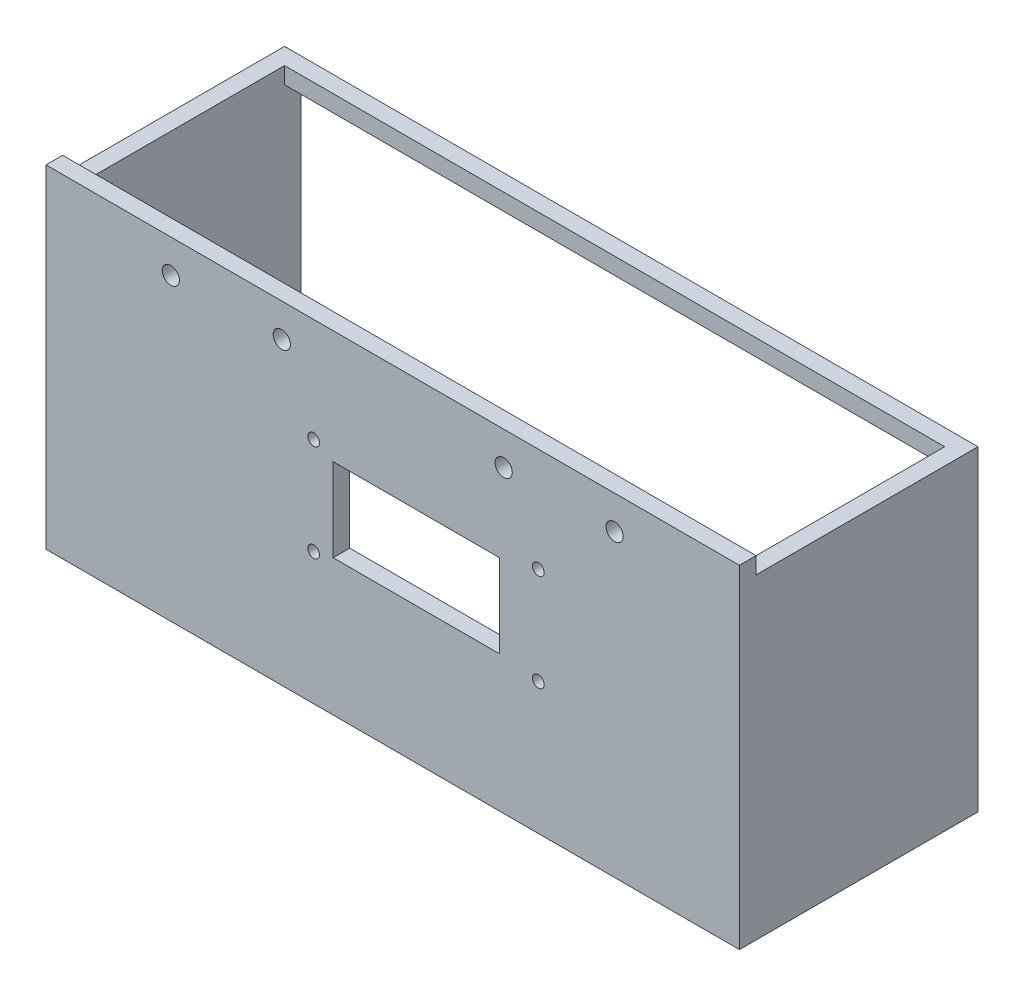
ISO-10303-21;
HEADER;
FILE_DESCRIPTION(('STEP AP214'),'2;1');
FILE_NAME('part.step','',(''),(''),'','','');
FILE_SCHEMA(('AUTOMOTIVE_DESIGN { 1 0 10303 214 1 1 1 1 }'));
ENDSEC;
DATA;
#1=APPLICATION_CONTEXT('core data for automotive mechanical design processes');
#2=APPLICATION_PROTOCOL_DEFINITION('international standard','automotive_design',2000,#1);
#3=PRODUCT_CONTEXT('',#1,'mechanical');
#4=PRODUCT('Part','Part','',(#3));
#5=PRODUCT_RELATED_PRODUCT_CATEGORY('part','',(#4));
#6=PRODUCT_DEFINITION_FORMATION('','',#4);
#7=PRODUCT_DEFINITION_CONTEXT('part definition',#1,'design');
#8=PRODUCT_DEFINITION('design','',#6,#7);
#9=PRODUCT_DEFINITION_SHAPE('','',#8);
#10=(LENGTH_UNIT() NAMED_UNIT(*) SI_UNIT(.MILLI.,.METRE.));
#11=(NAMED_UNIT(*) PLANE_ANGLE_UNIT() SI_UNIT($,.RADIAN.));
#12=(NAMED_UNIT(*) SI_UNIT($,.STERADIAN.) SOLID_ANGLE_UNIT());
#13=UNCERTAINTY_MEASURE_WITH_UNIT(LENGTH_MEASURE(1.E-05),#10,'distance_accuracy_value','');
#14=(GEOMETRIC_REPRESENTATION_CONTEXT(3) GLOBAL_UNCERTAINTY_ASSIGNED_CONTEXT((#13)) GLOBAL_UNIT_ASSIGNED_CONTEXT((#10,
#11,#12)) REPRESENTATION_CONTEXT('',''));
#15=CARTESIAN_POINT('',(0.,0.,0.));
#16=DIRECTION('',(0.,0.,1.));
#17=DIRECTION('',(1.,0.,0.));
#18=AXIS2_PLACEMENT_3D('',#15,#16,#17);
#19=CARTESIAN_POINT('',(0.,0.,3.));
#20=DIRECTION('',(0.,0.,1.));
#21=DIRECTION('',(1.,0.,0.));
#22=AXIS2_PLACEMENT_3D('',#19,#20,#21);
#23=PLANE('',#22);
#24=DIRECTION('',(1.,0.,0.));
#25=VECTOR('',#24,1.);
#26=CARTESIAN_POINT('',(-62.5,-30.,3.));
#27=LINE('',#26,#25);
#28=CARTESIAN_POINT('',(-62.5,-30.,3.));
#29=VERTEX_POINT('',#28);
#30=CARTESIAN_POINT('',(62.5,-30.,3.));
#31=VERTEX_POINT('',#30);
#32=EDGE_CURVE('E355',#29,#31,#27,.T.);
#33=ORIENTED_EDGE('',*,*,#32,.T.);
#34=DIRECTION('',(0.,1.,0.));
#35=VECTOR('',#34,1.);
#36=CARTESIAN_POINT('',(62.5,30.,3.));
#37=LINE('',#36,#35);
#38=CARTESIAN_POINT('',(62.5,30.,3.));
#39=VERTEX_POINT('',#38);
#40=EDGE_CURVE('E345',#31,#39,#37,.T.);
#41=ORIENTED_EDGE('',*,*,#40,.T.);
#42=DIRECTION('',(-1.,0.,0.));
#43=VECTOR('',#42,1.);
#44=CARTESIAN_POINT('',(-62.5,30.,3.));
#45=LINE('',#44,#43);
#46=CARTESIAN_POINT('',(-62.5,30.,3.));
#47=VERTEX_POINT('',#46);
#48=EDGE_CURVE('E348',#39,#47,#45,.T.);
#49=ORIENTED_EDGE('',*,*,#48,.T.);
#50=DIRECTION('',(0.,-1.,0.));
#51=VECTOR('',#50,1.);
#52=CARTESIAN_POINT('',(-62.5,30.,3.));
#53=LINE('',#52,#51);
#54=EDGE_CURVE('E352',#47,#29,#53,.T.);
#55=ORIENTED_EDGE('',*,*,#54,.T.);
#56=EDGE_LOOP('',(#33,#41,#49,#55));
#57=FACE_BOUND('',#56,.T.);
#58=CARTESIAN_POINT('',(26.25,11.25,3.));
#59=DIRECTION('',(0.,0.,1.));
#60=DIRECTION('',(1.,0.,0.));
#61=AXIS2_PLACEMENT_3D('',#58,#59,#60);
#62=CIRCLE('',#61,1.05);
#63=CARTESIAN_POINT('',(27.3,11.25,3.));
#64=VERTEX_POINT('',#63);
#65=EDGE_CURVE('E289',#64,#64,#62,.T.);
#66=ORIENTED_EDGE('',*,*,#65,.F.);
#67=EDGE_LOOP('',(#66));
#68=FACE_BOUND('',#67,.T.);
#69=CARTESIAN_POINT('',(-14.25,11.25,3.));
#70=DIRECTION('',(0.,0.,1.));
#71=DIRECTION('',(1.,0.,0.));
#72=AXIS2_PLACEMENT_3D('',#69,#70,#71);
#73=CIRCLE('',#72,1.05);
#74=CARTESIAN_POINT('',(-13.2,11.25,3.));
#75=VERTEX_POINT('',#74);
#76=EDGE_CURVE('E305',#75,#75,#73,.T.);
#77=ORIENTED_EDGE('',*,*,#76,.F.);
#78=EDGE_LOOP('',(#77));
#79=FACE_BOUND('',#78,.T.);
#80=CARTESIAN_POINT('',(20.,24.,3.));
#81=DIRECTION('',(0.,0.,1.));
#82=DIRECTION('',(1.,0.,0.));
#83=AXIS2_PLACEMENT_3D('',#80,#81,#82);
#84=CIRCLE('',#83,1.55);
#85=CARTESIAN_POINT('',(21.55,24.,3.));
#86=VERTEX_POINT('',#85);
#87=EDGE_CURVE('E321',#86,#86,#84,.T.);
#88=ORIENTED_EDGE('',*,*,#87,.F.);
#89=EDGE_LOOP('',(#88));
#90=FACE_BOUND('',#89,.T.);
#91=CARTESIAN_POINT('',(-40.,24.,3.));
#92=DIRECTION('',(0.,0.,1.));
#93=DIRECTION('',(1.,0.,0.));
#94=AXIS2_PLACEMENT_3D('',#91,#92,#93);
#95=CIRCLE('',#94,1.55);
#96=CARTESIAN_POINT('',(-38.45,24.,3.));
#97=VERTEX_POINT('',#96);
#98=EDGE_CURVE('E337',#97,#97,#95,.T.);
#99=ORIENTED_EDGE('',*,*,#98,.F.);
#100=EDGE_LOOP('',(#99));
#101=FACE_BOUND('',#100,.T.);
#102=CARTESIAN_POINT('',(-20.,24.,3.));
#103=DIRECTION('',(0.,0.,1.));
#104=DIRECTION('',(1.,0.,0.));
#105=AXIS2_PLACEMENT_3D('',#102,#103,#104);
#106=CIRCLE('',#105,1.55);
#107=CARTESIAN_POINT('',(-18.45,24.,3.));
#108=VERTEX_POINT('',#107);
#109=EDGE_CURVE('E329',#108,#108,#106,.T.);
#110=ORIENTED_EDGE('',*,*,#109,.F.);
#111=EDGE_LOOP('',(#110));
#112=FACE_BOUND('',#111,.T.);
#113=CARTESIAN_POINT('',(40.,24.,3.));
#114=DIRECTION('',(0.,0.,1.));
#115=DIRECTION('',(1.,0.,0.));
#116=AXIS2_PLACEMENT_3D('',#113,#114,#115);
#117=CIRCLE('',#116,1.54999999999999);
#118=CARTESIAN_POINT('',(41.55,24.,3.));
#119=VERTEX_POINT('',#118);
#120=EDGE_CURVE('E313',#119,#119,#117,.T.);
#121=ORIENTED_EDGE('',*,*,#120,.F.);
#122=EDGE_LOOP('',(#121));
#123=FACE_BOUND('',#122,.T.);
#124=CARTESIAN_POINT('',(-14.25,-6.25,3.));
#125=DIRECTION('',(0.,0.,1.));
#126=DIRECTION('',(1.,0.,0.));
#127=AXIS2_PLACEMENT_3D('',#124,#125,#126);
#128=CIRCLE('',#127,1.05);
#129=CARTESIAN_POINT('',(-13.2,-6.25,3.));
#130=VERTEX_POINT('',#129);
#131=EDGE_CURVE('E297',#130,#130,#128,.T.);
#132=ORIENTED_EDGE('',*,*,#131,.F.);
#133=EDGE_LOOP('',(#132));
#134=FACE_BOUND('',#133,.T.);
#135=CARTESIAN_POINT('',(26.25,-6.25,3.));
#136=DIRECTION('',(0.,0.,1.));
#137=DIRECTION('',(1.,0.,0.));
#138=AXIS2_PLACEMENT_3D('',#135,#136,#137);
#139=CIRCLE('',#138,1.05);
#140=CARTESIAN_POINT('',(27.3,-6.25,3.));
#141=VERTEX_POINT('',#140);
#142=EDGE_CURVE('E281',#141,#141,#139,.T.);
#143=ORIENTED_EDGE('',*,*,#142,.F.);
#144=EDGE_LOOP('',(#143));
#145=FACE_BOUND('',#144,.T.);
#146=DIRECTION('',(-1.,0.,0.));
#147=VECTOR('',#146,1.);
#148=CARTESIAN_POINT('',(-10.75,9.55,3.));
#149=LINE('',#148,#147);
#150=CARTESIAN_POINT('',(19.25,9.55,3.));
#151=VERTEX_POINT('',#150);
#152=CARTESIAN_POINT('',(-10.75,9.55,3.));
#153=VERTEX_POINT('',#152);
#154=EDGE_CURVE('E241',#151,#153,#149,.T.);
#155=ORIENTED_EDGE('',*,*,#154,.F.);
#156=DIRECTION('',(0.,1.,0.));
#157=VECTOR('',#156,1.);
#158=CARTESIAN_POINT('',(19.25,9.55,3.));
#159=LINE('',#158,#157);
#160=CARTESIAN_POINT('',(19.25,-5.45,3.));
#161=VERTEX_POINT('',#160);
#162=EDGE_CURVE('E238',#161,#151,#159,.T.);
#163=ORIENTED_EDGE('',*,*,#162,.F.);
#164=DIRECTION('',(1.,0.,0.));
#165=VECTOR('',#164,1.);
#166=CARTESIAN_POINT('',(-10.75,-5.45,3.));
#167=LINE('',#166,#165);
#168=CARTESIAN_POINT('',(-10.75,-5.45,3.));
#169=VERTEX_POINT('',#168);
#170=EDGE_CURVE('E249',#169,#161,#167,.T.);
#171=ORIENTED_EDGE('',*,*,#170,.F.);
#172=DIRECTION('',(0.,-1.,0.));
#173=VECTOR('',#172,1.);
#174=CARTESIAN_POINT('',(-10.75,9.55,3.));
#175=LINE('',#174,#173);
#176=EDGE_CURVE('E245',#153,#169,#175,.T.);
#177=ORIENTED_EDGE('',*,*,#176,.F.);
#178=EDGE_LOOP('',(#155,#163,#171,#177));
#179=FACE_BOUND('',#178,.T.);
#180=ADVANCED_FACE('F39',(#57,#68,#79,#90,#101,#112,#123,#134,#145,#179),#23,.T.);
#181=CARTESIAN_POINT('',(0.,0.,0.));
#182=DIRECTION('',(0.,0.,1.));
#183=DIRECTION('',(1.,0.,0.));
#184=AXIS2_PLACEMENT_3D('',#181,#182,#183);
#185=PLANE('',#184);
#186=CARTESIAN_POINT('',(26.25,-6.25,0.));
#187=DIRECTION('',(0.,0.,1.));
#188=DIRECTION('',(1.,0.,0.));
#189=AXIS2_PLACEMENT_3D('',#186,#187,#188);
#190=CIRCLE('',#189,1.05);
#191=CARTESIAN_POINT('',(27.3,-6.25,0.));
#192=VERTEX_POINT('',#191);
#193=EDGE_CURVE('E280',#192,#192,#190,.T.);
#194=ORIENTED_EDGE('',*,*,#193,.T.);
#195=EDGE_LOOP('',(#194));
#196=FACE_BOUND('',#195,.T.);
#197=CARTESIAN_POINT('',(26.25,11.25,0.));
#198=DIRECTION('',(0.,0.,1.));
#199=DIRECTION('',(1.,0.,0.));
#200=AXIS2_PLACEMENT_3D('',#197,#198,#199);
#201=CIRCLE('',#200,1.05);
#202=CARTESIAN_POINT('',(27.3,11.25,0.));
#203=VERTEX_POINT('',#202);
#204=EDGE_CURVE('E285',#203,#203,#201,.T.);
#205=ORIENTED_EDGE('',*,*,#204,.T.);
#206=EDGE_LOOP('',(#205));
#207=FACE_BOUND('',#206,.T.);
#208=CARTESIAN_POINT('',(-14.25,-6.25,0.));
#209=DIRECTION('',(0.,0.,1.));
#210=DIRECTION('',(1.,0.,0.));
#211=AXIS2_PLACEMENT_3D('',#208,#209,#210);
#212=CIRCLE('',#211,1.05);
#213=CARTESIAN_POINT('',(-13.2,-6.25,0.));
#214=VERTEX_POINT('',#213);
#215=EDGE_CURVE('E293',#214,#214,#212,.T.);
#216=ORIENTED_EDGE('',*,*,#215,.T.);
#217=EDGE_LOOP('',(#216));
#218=FACE_BOUND('',#217,.T.);
#219=CARTESIAN_POINT('',(-14.25,11.25,0.));
#220=DIRECTION('',(0.,0.,1.));
#221=DIRECTION('',(1.,0.,0.));
#222=AXIS2_PLACEMENT_3D('',#219,#220,#221);
#223=CIRCLE('',#222,1.05);
#224=CARTESIAN_POINT('',(-13.2,11.25,0.));
#225=VERTEX_POINT('',#224);
#226=EDGE_CURVE('E301',#225,#225,#223,.T.);
#227=ORIENTED_EDGE('',*,*,#226,.T.);
#228=EDGE_LOOP('',(#227));
#229=FACE_BOUND('',#228,.T.);
#230=CARTESIAN_POINT('',(40.,24.,0.));
#231=DIRECTION('',(0.,0.,1.));
#232=DIRECTION('',(1.,0.,0.));
#233=AXIS2_PLACEMENT_3D('',#230,#231,#232);
#234=CIRCLE('',#233,1.54999999999999);
#235=CARTESIAN_POINT('',(41.55,24.,0.));
#236=VERTEX_POINT('',#235);
#237=EDGE_CURVE('E309',#236,#236,#234,.T.);
#238=ORIENTED_EDGE('',*,*,#237,.T.);
#239=EDGE_LOOP('',(#238));
#240=FACE_BOUND('',#239,.T.);
#241=CARTESIAN_POINT('',(20.,24.,0.));
#242=DIRECTION('',(0.,0.,1.));
#243=DIRECTION('',(1.,0.,0.));
#244=AXIS2_PLACEMENT_3D('',#241,#242,#243);
#245=CIRCLE('',#244,1.55);
#246=CARTESIAN_POINT('',(21.55,24.,0.));
#247=VERTEX_POINT('',#246);
#248=EDGE_CURVE('E317',#247,#247,#245,.T.);
#249=ORIENTED_EDGE('',*,*,#248,.T.);
#250=EDGE_LOOP('',(#249));
#251=FACE_BOUND('',#250,.T.);
#252=CARTESIAN_POINT('',(-20.,24.,0.));
#253=DIRECTION('',(0.,0.,1.));
#254=DIRECTION('',(1.,0.,0.));
#255=AXIS2_PLACEMENT_3D('',#252,#253,#254);
#256=CIRCLE('',#255,1.55);
#257=CARTESIAN_POINT('',(-18.45,24.,0.));
#258=VERTEX_POINT('',#257);
#259=EDGE_CURVE('E325',#258,#258,#256,.T.);
#260=ORIENTED_EDGE('',*,*,#259,.T.);
#261=EDGE_LOOP('',(#260));
#262=FACE_BOUND('',#261,.T.);
#263=CARTESIAN_POINT('',(-40.,24.,0.));
#264=DIRECTION('',(0.,0.,1.));
#265=DIRECTION('',(1.,0.,0.));
#266=AXIS2_PLACEMENT_3D('',#263,#264,#265);
#267=CIRCLE('',#266,1.55);
#268=CARTESIAN_POINT('',(-38.45,24.,0.));
#269=VERTEX_POINT('',#268);
#270=EDGE_CURVE('E333',#269,#269,#267,.T.);
#271=ORIENTED_EDGE('',*,*,#270,.T.);
#272=EDGE_LOOP('',(#271));
#273=FACE_BOUND('',#272,.T.);
#274=DIRECTION('',(-1.,0.,0.));
#275=VECTOR('',#274,1.);
#276=CARTESIAN_POINT('',(0.,27.,0.));
#277=LINE('',#276,#275);
#278=CARTESIAN_POINT('',(62.5,27.,0.));
#279=VERTEX_POINT('',#278);
#280=CARTESIAN_POINT('',(59.5,27.,0.));
#281=VERTEX_POINT('',#280);
#282=EDGE_CURVE('E211',#279,#281,#277,.T.);
#283=ORIENTED_EDGE('',*,*,#282,.T.);
#284=DIRECTION('',(0.,-1.,0.));
#285=VECTOR('',#284,1.);
#286=CARTESIAN_POINT('',(59.5,0.,0.));
#287=LINE('',#286,#285);
#288=CARTESIAN_POINT('',(59.5,-30.,0.));
#289=VERTEX_POINT('',#288);
#290=EDGE_CURVE('E202',#281,#289,#287,.T.);
#291=ORIENTED_EDGE('',*,*,#290,.T.);
#292=DIRECTION('',(1.,0.,0.));
#293=VECTOR('',#292,1.);
#294=CARTESIAN_POINT('',(-62.5,-30.,0.));
#295=LINE('',#294,#293);
#296=CARTESIAN_POINT('',(-59.5,-30.,0.));
#297=VERTEX_POINT('',#296);
#298=EDGE_CURVE('E349',#297,#289,#295,.T.);
#299=ORIENTED_EDGE('',*,*,#298,.F.);
#300=DIRECTION('',(0.,1.,0.));
#301=VECTOR('',#300,1.);
#302=CARTESIAN_POINT('',(-59.5,0.,0.));
#303=LINE('',#302,#301);
#304=CARTESIAN_POINT('',(-59.5,27.,0.));
#305=VERTEX_POINT('',#304);
#306=EDGE_CURVE('E229',#297,#305,#303,.T.);
#307=ORIENTED_EDGE('',*,*,#306,.T.);
#308=DIRECTION('',(-1.,0.,0.));
#309=VECTOR('',#308,1.);
#310=CARTESIAN_POINT('',(0.,27.,0.));
#311=LINE('',#310,#309);
#312=CARTESIAN_POINT('',(-62.5,27.,0.));
#313=VERTEX_POINT('',#312);
#314=EDGE_CURVE('E156',#305,#313,#311,.T.);
#315=ORIENTED_EDGE('',*,*,#314,.T.);
#316=DIRECTION('',(0.,-1.,0.));
#317=VECTOR('',#316,1.);
#318=CARTESIAN_POINT('',(-62.5,30.,0.));
#319=LINE('',#318,#317);
#320=CARTESIAN_POINT('',(-62.5,30.,0.));
#321=VERTEX_POINT('',#320);
#322=EDGE_CURVE('E364',#321,#313,#319,.T.);
#323=ORIENTED_EDGE('',*,*,#322,.F.);
#324=DIRECTION('',(-1.,0.,0.));
#325=VECTOR('',#324,1.);
#326=CARTESIAN_POINT('',(-62.5,30.,0.));
#327=LINE('',#326,#325);
#328=CARTESIAN_POINT('',(62.5,30.,0.));
#329=VERTEX_POINT('',#328);
#330=EDGE_CURVE('E361',#329,#321,#327,.T.);
#331=ORIENTED_EDGE('',*,*,#330,.F.);
#332=DIRECTION('',(0.,1.,0.));
#333=VECTOR('',#332,1.);
#334=CARTESIAN_POINT('',(62.5,30.,0.));
#335=LINE('',#334,#333);
#336=EDGE_CURVE('E341',#279,#329,#335,.T.);
#337=ORIENTED_EDGE('',*,*,#336,.F.);
#338=EDGE_LOOP('',(#283,#291,#299,#307,#315,#323,#331,#337));
#339=FACE_BOUND('',#338,.T.);
#340=DIRECTION('',(0.,1.,0.));
#341=VECTOR('',#340,1.);
#342=CARTESIAN_POINT('',(19.25,9.55,0.));
#343=LINE('',#342,#341);
#344=CARTESIAN_POINT('',(19.25,-5.45,0.));
#345=VERTEX_POINT('',#344);
#346=CARTESIAN_POINT('',(19.25,9.55,0.));
#347=VERTEX_POINT('',#346);
#348=EDGE_CURVE('E237',#345,#347,#343,.T.);
#349=ORIENTED_EDGE('',*,*,#348,.T.);
#350=DIRECTION('',(-1.,0.,0.));
#351=VECTOR('',#350,1.);
#352=CARTESIAN_POINT('',(-10.75,9.55,0.));
#353=LINE('',#352,#351);
#354=CARTESIAN_POINT('',(-10.75,9.55,0.));
#355=VERTEX_POINT('',#354);
#356=EDGE_CURVE('E256',#347,#355,#353,.T.);
#357=ORIENTED_EDGE('',*,*,#356,.T.);
#358=DIRECTION('',(0.,-1.,0.));
#359=VECTOR('',#358,1.);
#360=CARTESIAN_POINT('',(-10.75,9.55,0.));
#361=LINE('',#360,#359);
#362=CARTESIAN_POINT('',(-10.75,-5.45,0.));
#363=VERTEX_POINT('',#362);
#364=EDGE_CURVE('E260',#355,#363,#361,.T.);
#365=ORIENTED_EDGE('',*,*,#364,.T.);
#366=DIRECTION('',(1.,0.,0.));
#367=VECTOR('',#366,1.);
#368=CARTESIAN_POINT('',(-10.75,-5.45,0.));
#369=LINE('',#368,#367);
#370=EDGE_CURVE('E242',#363,#345,#369,.T.);
#371=ORIENTED_EDGE('',*,*,#370,.T.);
#372=EDGE_LOOP('',(#349,#357,#365,#371));
#373=FACE_BOUND('',#372,.T.);
#374=ADVANCED_FACE('F395',(#196,#207,#218,#229,#240,#251,#262,#273,#339,#373),#185,.F.);
#375=CARTESIAN_POINT('',(62.5,30.,3.));
#376=DIRECTION('',(-1.,0.,0.));
#377=DIRECTION('',(0.,-1.,0.));
#378=AXIS2_PLACEMENT_3D('',#375,#376,#377);
#379=PLANE('',#378);
#380=DIRECTION('',(0.,0.,1.));
#381=VECTOR('',#380,1.);
#382=CARTESIAN_POINT('',(62.5,27.,-40.));
#383=LINE('',#382,#381);
#384=CARTESIAN_POINT('',(62.5,27.,-40.));
#385=VERTEX_POINT('',#384);
#386=EDGE_CURVE('E198',#385,#279,#383,.T.);
#387=ORIENTED_EDGE('',*,*,#386,.T.);
#388=ORIENTED_EDGE('',*,*,#336,.T.);
#389=DIRECTION('',(0.,0.,-1.));
#390=VECTOR('',#389,1.);
#391=CARTESIAN_POINT('',(62.5,30.,3.));
#392=LINE('',#391,#390);
#393=EDGE_CURVE('E48',#39,#329,#392,.T.);
#394=ORIENTED_EDGE('',*,*,#393,.F.);
#395=ORIENTED_EDGE('',*,*,#40,.F.);
#396=DIRECTION('',(0.,0.,-1.));
#397=VECTOR('',#396,1.);
#398=CARTESIAN_POINT('',(62.5,-30.,3.));
#399=LINE('',#398,#397);
#400=CARTESIAN_POINT('',(62.5,-30.,-40.));
#401=VERTEX_POINT('',#400);
#402=EDGE_CURVE('E358',#31,#401,#399,.T.);
#403=ORIENTED_EDGE('',*,*,#402,.T.);
#404=DIRECTION('',(0.,1.,0.));
#405=VECTOR('',#404,1.);
#406=CARTESIAN_POINT('',(62.5,-30.,-40.));
#407=LINE('',#406,#405);
#408=EDGE_CURVE('E169',#401,#385,#407,.T.);
#409=ORIENTED_EDGE('',*,*,#408,.T.);
#410=EDGE_LOOP('',(#387,#388,#394,#395,#403,#409));
#411=FACE_BOUND('',#410,.T.);
#412=ADVANCED_FACE('F41',(#411),#379,.F.);
#413=CARTESIAN_POINT('',(-62.5,30.,3.));
#414=DIRECTION('',(0.,-1.,0.));
#415=DIRECTION('',(0.,0.,-1.));
#416=AXIS2_PLACEMENT_3D('',#413,#414,#415);
#417=PLANE('',#416);
#418=ORIENTED_EDGE('',*,*,#330,.T.);
#419=DIRECTION('',(0.,0.,-1.));
#420=VECTOR('',#419,1.);
#421=CARTESIAN_POINT('',(-62.5,30.,3.));
#422=LINE('',#421,#420);
#423=EDGE_CURVE('E377',#47,#321,#422,.T.);
#424=ORIENTED_EDGE('',*,*,#423,.F.);
#425=ORIENTED_EDGE('',*,*,#48,.F.);
#426=ORIENTED_EDGE('',*,*,#393,.T.);
#427=EDGE_LOOP('',(#418,#424,#425,#426));
#428=FACE_BOUND('',#427,.T.);
#429=ADVANCED_FACE('F385',(#428),#417,.F.);
#430=CARTESIAN_POINT('',(-62.5,30.,3.));
#431=DIRECTION('',(1.,0.,0.));
#432=DIRECTION('',(0.,0.,-1.));
#433=AXIS2_PLACEMENT_3D('',#430,#431,#432);
#434=PLANE('',#433);
#435=ORIENTED_EDGE('',*,*,#322,.T.);
#436=DIRECTION('',(0.,0.,1.));
#437=VECTOR('',#436,1.);
#438=CARTESIAN_POINT('',(-62.5,27.,-40.));
#439=LINE('',#438,#437);
#440=CARTESIAN_POINT('',(-62.5,27.,-40.));
#441=VERTEX_POINT('',#440);
#442=EDGE_CURVE('E160',#441,#313,#439,.T.);
#443=ORIENTED_EDGE('',*,*,#442,.F.);
#444=DIRECTION('',(0.,-1.,0.));
#445=VECTOR('',#444,1.);
#446=CARTESIAN_POINT('',(-62.5,-30.,-40.));
#447=LINE('',#446,#445);
#448=CARTESIAN_POINT('',(-62.5,-30.,-40.));
#449=VERTEX_POINT('',#448);
#450=EDGE_CURVE('E215',#441,#449,#447,.T.);
#451=ORIENTED_EDGE('',*,*,#450,.T.);
#452=DIRECTION('',(0.,0.,-1.));
#453=VECTOR('',#452,1.);
#454=CARTESIAN_POINT('',(-62.5,-30.,3.));
#455=LINE('',#454,#453);
#456=EDGE_CURVE('E373',#29,#449,#455,.T.);
#457=ORIENTED_EDGE('',*,*,#456,.F.);
#458=ORIENTED_EDGE('',*,*,#54,.F.);
#459=ORIENTED_EDGE('',*,*,#423,.T.);
#460=EDGE_LOOP('',(#435,#443,#451,#457,#458,#459));
#461=FACE_BOUND('',#460,.T.);
#462=ADVANCED_FACE('F398',(#461),#434,.F.);
#463=CARTESIAN_POINT('',(-62.5,-30.,3.));
#464=DIRECTION('',(0.,1.,0.));
#465=DIRECTION('',(0.,0.,1.));
#466=AXIS2_PLACEMENT_3D('',#463,#464,#465);
#467=PLANE('',#466);
#468=ORIENTED_EDGE('',*,*,#298,.T.);
#469=DIRECTION('',(0.,0.,1.));
#470=VECTOR('',#469,1.);
#471=CARTESIAN_POINT('',(59.5,-30.,-40.));
#472=LINE('',#471,#470);
#473=CARTESIAN_POINT('',(59.5,-30.,-40.));
#474=VERTEX_POINT('',#473);
#475=EDGE_CURVE('E199',#474,#289,#472,.T.);
#476=ORIENTED_EDGE('',*,*,#475,.F.);
#477=DIRECTION('',(1.,0.,0.));
#478=VECTOR('',#477,1.);
#479=CARTESIAN_POINT('',(62.5,-30.,-40.));
#480=LINE('',#479,#478);
#481=EDGE_CURVE('E194',#474,#401,#480,.T.);
#482=ORIENTED_EDGE('',*,*,#481,.T.);
#483=ORIENTED_EDGE('',*,*,#402,.F.);
#484=ORIENTED_EDGE('',*,*,#32,.F.);
#485=ORIENTED_EDGE('',*,*,#456,.T.);
#486=DIRECTION('',(1.,0.,0.));
#487=VECTOR('',#486,1.);
#488=CARTESIAN_POINT('',(-62.5,-30.,-40.));
#489=LINE('',#488,#487);
#490=CARTESIAN_POINT('',(-59.5,-30.,-40.));
#491=VERTEX_POINT('',#490);
#492=EDGE_CURVE('E218',#449,#491,#489,.T.);
#493=ORIENTED_EDGE('',*,*,#492,.T.);
#494=DIRECTION('',(0.,0.,1.));
#495=VECTOR('',#494,1.);
#496=CARTESIAN_POINT('',(-59.5,-30.,-40.));
#497=LINE('',#496,#495);
#498=EDGE_CURVE('E161',#491,#297,#497,.T.);
#499=ORIENTED_EDGE('',*,*,#498,.T.);
#500=EDGE_LOOP('',(#468,#476,#482,#483,#484,#485,#493,#499));
#501=FACE_BOUND('',#500,.T.);
#502=ADVANCED_FACE('F407',(#501),#467,.F.);
#503=CARTESIAN_POINT('',(-40.,24.,3.));
#504=DIRECTION('',(0.,0.,-1.));
#505=DIRECTION('',(-1.,0.,0.));
#506=AXIS2_PLACEMENT_3D('',#503,#504,#505);
#507=CYLINDRICAL_SURFACE('',#506,1.55);
#508=ORIENTED_EDGE('',*,*,#98,.T.);
#509=EDGE_LOOP('',(#508));
#510=FACE_BOUND('',#509,.T.);
#511=ORIENTED_EDGE('',*,*,#270,.F.);
#512=EDGE_LOOP('',(#511));
#513=FACE_BOUND('',#512,.T.);
#514=ADVANCED_FACE('F439',(#510,#513),#507,.F.);
#515=CARTESIAN_POINT('',(-20.,24.,3.));
#516=DIRECTION('',(0.,0.,-1.));
#517=DIRECTION('',(-1.,0.,0.));
#518=AXIS2_PLACEMENT_3D('',#515,#516,#517);
#519=CYLINDRICAL_SURFACE('',#518,1.55);
#520=ORIENTED_EDGE('',*,*,#109,.T.);
#521=EDGE_LOOP('',(#520));
#522=FACE_BOUND('',#521,.T.);
#523=ORIENTED_EDGE('',*,*,#259,.F.);
#524=EDGE_LOOP('',(#523));
#525=FACE_BOUND('',#524,.T.);
#526=ADVANCED_FACE('F477',(#522,#525),#519,.F.);
#527=CARTESIAN_POINT('',(20.,24.,3.));
#528=DIRECTION('',(0.,0.,-1.));
#529=DIRECTION('',(-1.,0.,0.));
#530=AXIS2_PLACEMENT_3D('',#527,#528,#529);
#531=CYLINDRICAL_SURFACE('',#530,1.55);
#532=ORIENTED_EDGE('',*,*,#87,.T.);
#533=EDGE_LOOP('',(#532));
#534=FACE_BOUND('',#533,.T.);
#535=ORIENTED_EDGE('',*,*,#248,.F.);
#536=EDGE_LOOP('',(#535));
#537=FACE_BOUND('',#536,.T.);
#538=ADVANCED_FACE('F484',(#534,#537),#531,.F.);
#539=CARTESIAN_POINT('',(40.,24.,3.));
#540=DIRECTION('',(0.,0.,-1.));
#541=DIRECTION('',(-1.,0.,0.));
#542=AXIS2_PLACEMENT_3D('',#539,#540,#541);
#543=CYLINDRICAL_SURFACE('',#542,1.54999999999999);
#544=ORIENTED_EDGE('',*,*,#120,.T.);
#545=EDGE_LOOP('',(#544));
#546=FACE_BOUND('',#545,.T.);
#547=ORIENTED_EDGE('',*,*,#237,.F.);
#548=EDGE_LOOP('',(#547));
#549=FACE_BOUND('',#548,.T.);
#550=ADVANCED_FACE('F491',(#546,#549),#543,.F.);
#551=CARTESIAN_POINT('',(-14.25,11.25,3.));
#552=DIRECTION('',(0.,0.,-1.));
#553=DIRECTION('',(-1.,0.,0.));
#554=AXIS2_PLACEMENT_3D('',#551,#552,#553);
#555=CYLINDRICAL_SURFACE('',#554,1.05);
#556=ORIENTED_EDGE('',*,*,#76,.T.);
#557=EDGE_LOOP('',(#556));
#558=FACE_BOUND('',#557,.T.);
#559=ORIENTED_EDGE('',*,*,#226,.F.);
#560=EDGE_LOOP('',(#559));
#561=FACE_BOUND('',#560,.T.);
#562=ADVANCED_FACE('F499',(#558,#561),#555,.F.);
#563=CARTESIAN_POINT('',(-14.25,-6.25,3.));
#564=DIRECTION('',(0.,0.,-1.));
#565=DIRECTION('',(-1.,0.,0.));
#566=AXIS2_PLACEMENT_3D('',#563,#564,#565);
#567=CYLINDRICAL_SURFACE('',#566,1.05);
#568=ORIENTED_EDGE('',*,*,#131,.T.);
#569=EDGE_LOOP('',(#568));
#570=FACE_BOUND('',#569,.T.);
#571=ORIENTED_EDGE('',*,*,#215,.F.);
#572=EDGE_LOOP('',(#571));
#573=FACE_BOUND('',#572,.T.);
#574=ADVANCED_FACE('F507',(#570,#573),#567,.F.);
#575=CARTESIAN_POINT('',(26.25,11.25,3.));
#576=DIRECTION('',(0.,0.,-1.));
#577=DIRECTION('',(-1.,0.,0.));
#578=AXIS2_PLACEMENT_3D('',#575,#576,#577);
#579=CYLINDRICAL_SURFACE('',#578,1.05);
#580=ORIENTED_EDGE('',*,*,#65,.T.);
#581=EDGE_LOOP('',(#580));
#582=FACE_BOUND('',#581,.T.);
#583=ORIENTED_EDGE('',*,*,#204,.F.);
#584=EDGE_LOOP('',(#583));
#585=FACE_BOUND('',#584,.T.);
#586=ADVANCED_FACE('F515',(#582,#585),#579,.F.);
#587=CARTESIAN_POINT('',(26.25,-6.25,3.));
#588=DIRECTION('',(0.,0.,-1.));
#589=DIRECTION('',(-1.,0.,0.));
#590=AXIS2_PLACEMENT_3D('',#587,#588,#589);
#591=CYLINDRICAL_SURFACE('',#590,1.05);
#592=ORIENTED_EDGE('',*,*,#142,.T.);
#593=EDGE_LOOP('',(#592));
#594=FACE_BOUND('',#593,.T.);
#595=ORIENTED_EDGE('',*,*,#193,.F.);
#596=EDGE_LOOP('',(#595));
#597=FACE_BOUND('',#596,.T.);
#598=ADVANCED_FACE('F523',(#594,#597),#591,.F.);
#599=CARTESIAN_POINT('',(19.25,9.55,3.));
#600=DIRECTION('',(-1.,0.,0.));
#601=DIRECTION('',(0.,-1.,0.));
#602=AXIS2_PLACEMENT_3D('',#599,#600,#601);
#603=PLANE('',#602);
#604=ORIENTED_EDGE('',*,*,#348,.F.);
#605=DIRECTION('',(0.,0.,-1.));
#606=VECTOR('',#605,1.);
#607=CARTESIAN_POINT('',(19.25,-5.45,3.));
#608=LINE('',#607,#606);
#609=EDGE_CURVE('E252',#161,#345,#608,.T.);
#610=ORIENTED_EDGE('',*,*,#609,.F.);
#611=ORIENTED_EDGE('',*,*,#162,.T.);
#612=DIRECTION('',(0.,0.,-1.));
#613=VECTOR('',#612,1.);
#614=CARTESIAN_POINT('',(19.25,9.55,3.));
#615=LINE('',#614,#613);
#616=EDGE_CURVE('E276',#151,#347,#615,.T.);
#617=ORIENTED_EDGE('',*,*,#616,.T.);
#618=EDGE_LOOP('',(#604,#610,#611,#617));
#619=FACE_BOUND('',#618,.T.);
#620=ADVANCED_FACE('F531',(#619),#603,.T.);
#621=CARTESIAN_POINT('',(-10.75,9.55,3.));
#622=DIRECTION('',(0.,-1.,0.));
#623=DIRECTION('',(0.,0.,-1.));
#624=AXIS2_PLACEMENT_3D('',#621,#622,#623);
#625=PLANE('',#624);
#626=ORIENTED_EDGE('',*,*,#356,.F.);
#627=ORIENTED_EDGE('',*,*,#616,.F.);
#628=ORIENTED_EDGE('',*,*,#154,.T.);
#629=DIRECTION('',(0.,0.,-1.));
#630=VECTOR('',#629,1.);
#631=CARTESIAN_POINT('',(-10.75,9.55,3.));
#632=LINE('',#631,#630);
#633=EDGE_CURVE('E273',#153,#355,#632,.T.);
#634=ORIENTED_EDGE('',*,*,#633,.T.);
#635=EDGE_LOOP('',(#626,#627,#628,#634));
#636=FACE_BOUND('',#635,.T.);
#637=ADVANCED_FACE('F539',(#636),#625,.T.);
#638=CARTESIAN_POINT('',(-10.75,9.55,3.));
#639=DIRECTION('',(1.,0.,0.));
#640=DIRECTION('',(0.,0.,-1.));
#641=AXIS2_PLACEMENT_3D('',#638,#639,#640);
#642=PLANE('',#641);
#643=ORIENTED_EDGE('',*,*,#364,.F.);
#644=ORIENTED_EDGE('',*,*,#633,.F.);
#645=ORIENTED_EDGE('',*,*,#176,.T.);
#646=DIRECTION('',(0.,0.,-1.));
#647=VECTOR('',#646,1.);
#648=CARTESIAN_POINT('',(-10.75,-5.45,3.));
#649=LINE('',#648,#647);
#650=EDGE_CURVE('E270',#169,#363,#649,.T.);
#651=ORIENTED_EDGE('',*,*,#650,.T.);
#652=EDGE_LOOP('',(#643,#644,#645,#651));
#653=FACE_BOUND('',#652,.T.);
#654=ADVANCED_FACE('F547',(#653),#642,.T.);
#655=CARTESIAN_POINT('',(-10.75,-5.45,3.));
#656=DIRECTION('',(0.,1.,0.));
#657=DIRECTION('',(0.,0.,1.));
#658=AXIS2_PLACEMENT_3D('',#655,#656,#657);
#659=PLANE('',#658);
#660=ORIENTED_EDGE('',*,*,#370,.F.);
#661=ORIENTED_EDGE('',*,*,#650,.F.);
#662=ORIENTED_EDGE('',*,*,#170,.T.);
#663=ORIENTED_EDGE('',*,*,#609,.T.);
#664=EDGE_LOOP('',(#660,#661,#662,#663));
#665=FACE_BOUND('',#664,.T.);
#666=ADVANCED_FACE('F555',(#665),#659,.T.);
#667=CARTESIAN_POINT('',(-62.5,27.,-40.));
#668=DIRECTION('',(0.,1.,0.));
#669=DIRECTION('',(0.,0.,1.));
#670=AXIS2_PLACEMENT_3D('',#667,#668,#669);
#671=PLANE('',#670);
#672=DIRECTION('',(0.,0.,1.));
#673=VECTOR('',#672,1.);
#674=CARTESIAN_POINT('',(-59.5,27.,-40.));
#675=LINE('',#674,#673);
#676=CARTESIAN_POINT('',(-59.5,27.,-37.));
#677=VERTEX_POINT('',#676);
#678=EDGE_CURVE('E151',#677,#305,#675,.T.);
#679=ORIENTED_EDGE('',*,*,#678,.F.);
#680=DIRECTION('',(1.,0.,0.));
#681=VECTOR('',#680,1.);
#682=CARTESIAN_POINT('',(-62.5,27.,-37.));
#683=LINE('',#682,#681);
#684=CARTESIAN_POINT('',(59.5,27.,-37.));
#685=VERTEX_POINT('',#684);
#686=EDGE_CURVE('E154',#677,#685,#683,.T.);
#687=ORIENTED_EDGE('',*,*,#686,.T.);
#688=DIRECTION('',(0.,0.,1.));
#689=VECTOR('',#688,1.);
#690=CARTESIAN_POINT('',(59.5,27.,-40.));
#691=LINE('',#690,#689);
#692=EDGE_CURVE('E203',#685,#281,#691,.T.);
#693=ORIENTED_EDGE('',*,*,#692,.T.);
#694=ORIENTED_EDGE('',*,*,#282,.F.);
#695=ORIENTED_EDGE('',*,*,#386,.F.);
#696=DIRECTION('',(-1.,0.,0.));
#697=VECTOR('',#696,1.);
#698=CARTESIAN_POINT('',(-62.5,27.,-40.));
#699=LINE('',#698,#697);
#700=EDGE_CURVE('E224',#385,#441,#699,.T.);
#701=ORIENTED_EDGE('',*,*,#700,.T.);
#702=ORIENTED_EDGE('',*,*,#442,.T.);
#703=ORIENTED_EDGE('',*,*,#314,.F.);
#704=EDGE_LOOP('',(#679,#687,#693,#694,#695,#701,#702,#703));
#705=FACE_BOUND('',#704,.T.);
#706=ADVANCED_FACE('F152',(#705),#671,.T.);
#707=CARTESIAN_POINT('',(-59.5,-30.,-40.));
#708=DIRECTION('',(1.,0.,0.));
#709=DIRECTION('',(0.,0.,-1.));
#710=AXIS2_PLACEMENT_3D('',#707,#708,#709);
#711=PLANE('',#710);
#712=DIRECTION('',(0.,-1.,0.));
#713=VECTOR('',#712,1.);
#714=CARTESIAN_POINT('',(-59.5,-30.,-37.));
#715=LINE('',#714,#713);
#716=CARTESIAN_POINT('',(-59.5,24.,-37.));
#717=VERTEX_POINT('',#716);
#718=EDGE_CURVE('E163',#677,#717,#715,.T.);
#719=ORIENTED_EDGE('',*,*,#718,.F.);
#720=ORIENTED_EDGE('',*,*,#678,.T.);
#721=ORIENTED_EDGE('',*,*,#306,.F.);
#722=ORIENTED_EDGE('',*,*,#498,.F.);
#723=DIRECTION('',(0.,1.,0.));
#724=VECTOR('',#723,1.);
#725=CARTESIAN_POINT('',(-59.5,-30.,-40.));
#726=LINE('',#725,#724);
#727=CARTESIAN_POINT('',(-59.5,24.,-40.));
#728=VERTEX_POINT('',#727);
#729=EDGE_CURVE('E60',#491,#728,#726,.T.);
#730=ORIENTED_EDGE('',*,*,#729,.T.);
#731=DIRECTION('',(0.,0.,1.));
#732=VECTOR('',#731,1.);
#733=CARTESIAN_POINT('',(-59.5,24.,-40.));
#734=LINE('',#733,#732);
#735=EDGE_CURVE('E55',#728,#717,#734,.T.);
#736=ORIENTED_EDGE('',*,*,#735,.T.);
#737=EDGE_LOOP('',(#719,#720,#721,#722,#730,#736));
#738=FACE_BOUND('',#737,.T.);
#739=ADVANCED_FACE('F164',(#738),#711,.T.);
#740=CARTESIAN_POINT('',(0.,0.,-40.));
#741=DIRECTION('',(0.,0.,-1.));
#742=DIRECTION('',(-1.,0.,0.));
#743=AXIS2_PLACEMENT_3D('',#740,#741,#742);
#744=PLANE('',#743);
#745=ORIENTED_EDGE('',*,*,#700,.F.);
#746=ORIENTED_EDGE('',*,*,#408,.F.);
#747=ORIENTED_EDGE('',*,*,#481,.F.);
#748=DIRECTION('',(0.,-1.,0.));
#749=VECTOR('',#748,1.);
#750=CARTESIAN_POINT('',(59.5,-30.,-40.));
#751=LINE('',#750,#749);
#752=CARTESIAN_POINT('',(59.5,24.,-40.));
#753=VERTEX_POINT('',#752);
#754=EDGE_CURVE('E191',#753,#474,#751,.T.);
#755=ORIENTED_EDGE('',*,*,#754,.F.);
#756=DIRECTION('',(-1.,0.,0.));
#757=VECTOR('',#756,1.);
#758=CARTESIAN_POINT('',(-62.5,24.,-40.));
#759=LINE('',#758,#757);
#760=EDGE_CURVE('E178',#753,#728,#759,.T.);
#761=ORIENTED_EDGE('',*,*,#760,.T.);
#762=ORIENTED_EDGE('',*,*,#729,.F.);
#763=ORIENTED_EDGE('',*,*,#492,.F.);
#764=ORIENTED_EDGE('',*,*,#450,.F.);
#765=EDGE_LOOP('',(#745,#746,#747,#755,#761,#762,#763,#764));
#766=FACE_BOUND('',#765,.T.);
#767=ADVANCED_FACE('F412',(#766),#744,.T.);
#768=CARTESIAN_POINT('',(59.5,-30.,-40.));
#769=DIRECTION('',(-1.,0.,0.));
#770=DIRECTION('',(0.,0.,1.));
#771=AXIS2_PLACEMENT_3D('',#768,#769,#770);
#772=PLANE('',#771);
#773=DIRECTION('',(0.,1.,0.));
#774=VECTOR('',#773,1.);
#775=CARTESIAN_POINT('',(59.5,-30.,-37.));
#776=LINE('',#775,#774);
#777=CARTESIAN_POINT('',(59.5,24.,-37.));
#778=VERTEX_POINT('',#777);
#779=EDGE_CURVE('E11',#778,#685,#776,.T.);
#780=ORIENTED_EDGE('',*,*,#779,.F.);
#781=DIRECTION('',(0.,0.,-1.));
#782=VECTOR('',#781,1.);
#783=CARTESIAN_POINT('',(59.5,24.,-40.));
#784=LINE('',#783,#782);
#785=EDGE_CURVE('E182',#778,#753,#784,.T.);
#786=ORIENTED_EDGE('',*,*,#785,.T.);
#787=ORIENTED_EDGE('',*,*,#754,.T.);
#788=ORIENTED_EDGE('',*,*,#475,.T.);
#789=ORIENTED_EDGE('',*,*,#290,.F.);
#790=ORIENTED_EDGE('',*,*,#692,.F.);
#791=EDGE_LOOP('',(#780,#786,#787,#788,#789,#790));
#792=FACE_BOUND('',#791,.T.);
#793=ADVANCED_FACE('F422',(#792),#772,.T.);
#794=CARTESIAN_POINT('',(-62.5,24.,-37.));
#795=DIRECTION('',(0.,0.,1.));
#796=DIRECTION('',(1.,0.,0.));
#797=AXIS2_PLACEMENT_3D('',#794,#795,#796);
#798=PLANE('',#797);
#799=ORIENTED_EDGE('',*,*,#686,.F.);
#800=ORIENTED_EDGE('',*,*,#718,.T.);
#801=DIRECTION('',(1.,0.,0.));
#802=VECTOR('',#801,1.);
#803=CARTESIAN_POINT('',(-62.5,24.,-37.));
#804=LINE('',#803,#802);
#805=EDGE_CURVE('E175',#717,#778,#804,.T.);
#806=ORIENTED_EDGE('',*,*,#805,.T.);
#807=ORIENTED_EDGE('',*,*,#779,.T.);
#808=EDGE_LOOP('',(#799,#800,#806,#807));
#809=FACE_BOUND('',#808,.T.);
#810=ADVANCED_FACE('F171',(#809),#798,.T.);
#811=CARTESIAN_POINT('',(0.,24.,0.));
#812=DIRECTION('',(0.,1.,0.));
#813=DIRECTION('',(0.,0.,1.));
#814=AXIS2_PLACEMENT_3D('',#811,#812,#813);
#815=PLANE('',#814);
#816=ORIENTED_EDGE('',*,*,#735,.F.);
#817=ORIENTED_EDGE('',*,*,#760,.F.);
#818=ORIENTED_EDGE('',*,*,#785,.F.);
#819=ORIENTED_EDGE('',*,*,#805,.F.);
#820=EDGE_LOOP('',(#816,#817,#818,#819));
#821=FACE_BOUND('',#820,.T.);
#822=ADVANCED_FACE('F421',(#821),#815,.F.);
#823=CLOSED_SHELL('',(#180,#374,#412,#429,#462,#502,#514,#526,#538,#550,#562,#574,#586,#598,
#620,#637,#654,#666,#706,#739,#767,#793,#810,#822));
#824=MANIFOLD_SOLID_BREP('B2',#823);
#825=ADVANCED_BREP_SHAPE_REPRESENTATION('',(#18,#824),#14);
#826=SHAPE_DEFINITION_REPRESENTATION(#9,#825);
ENDSEC;
END-ISO-10303-21;
